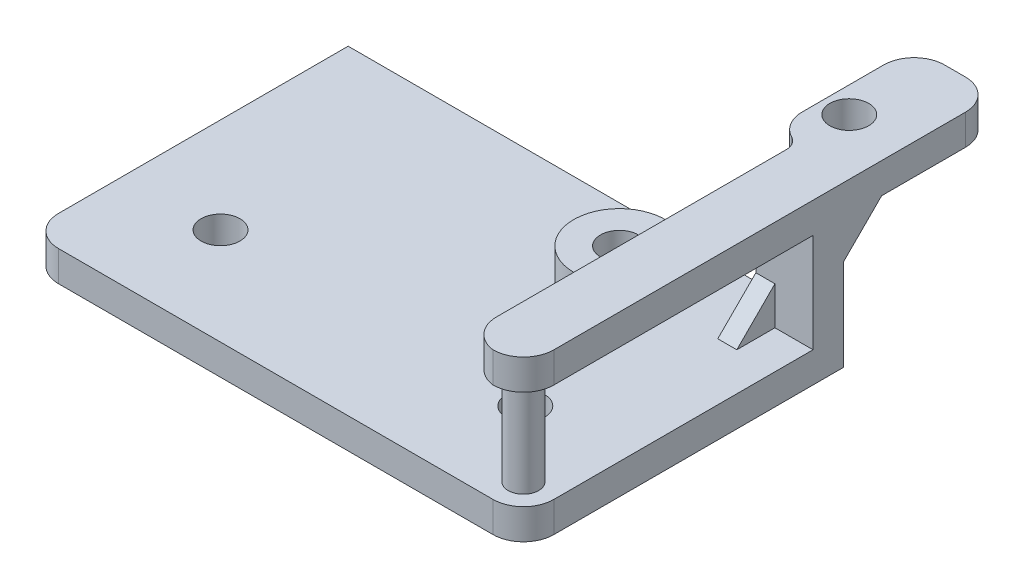
ISO-10303-21;
HEADER;
FILE_DESCRIPTION(('STEP AP214'),'2;1');
FILE_NAME('part.step','',(''),(''),'','','');
FILE_SCHEMA(('AUTOMOTIVE_DESIGN { 1 0 10303 214 1 1 1 1 }'));
ENDSEC;
DATA;
#1=APPLICATION_CONTEXT('core data for automotive mechanical design processes');
#2=APPLICATION_PROTOCOL_DEFINITION('international standard','automotive_design',2000,#1);
#3=PRODUCT_CONTEXT('',#1,'mechanical');
#4=PRODUCT('Part','Part','',(#3));
#5=PRODUCT_RELATED_PRODUCT_CATEGORY('part','',(#4));
#6=PRODUCT_DEFINITION_FORMATION('','',#4);
#7=PRODUCT_DEFINITION_CONTEXT('part definition',#1,'design');
#8=PRODUCT_DEFINITION('design','',#6,#7);
#9=PRODUCT_DEFINITION_SHAPE('','',#8);
#10=(LENGTH_UNIT() NAMED_UNIT(*) SI_UNIT(.MILLI.,.METRE.));
#11=(NAMED_UNIT(*) PLANE_ANGLE_UNIT() SI_UNIT($,.RADIAN.));
#12=(NAMED_UNIT(*) SI_UNIT($,.STERADIAN.) SOLID_ANGLE_UNIT());
#13=UNCERTAINTY_MEASURE_WITH_UNIT(LENGTH_MEASURE(1.E-05),#10,'distance_accuracy_value','');
#14=(GEOMETRIC_REPRESENTATION_CONTEXT(3) GLOBAL_UNCERTAINTY_ASSIGNED_CONTEXT((#13)) GLOBAL_UNIT_ASSIGNED_CONTEXT((#10,
#11,#12)) REPRESENTATION_CONTEXT('',''));
#15=CARTESIAN_POINT('',(0.,0.,0.));
#16=DIRECTION('',(0.,0.,1.));
#17=DIRECTION('',(1.,0.,0.));
#18=AXIS2_PLACEMENT_3D('',#15,#16,#17);
#19=CARTESIAN_POINT('',(45.4999999999992,9.,-32.1043329903239));
#20=DIRECTION('',(0.,-1.,0.));
#21=DIRECTION('',(0.,0.,-1.));
#22=AXIS2_PLACEMENT_3D('',#19,#20,#21);
#23=CYLINDRICAL_SURFACE('',#22,2.50000000000001);
#24=CARTESIAN_POINT('',(45.4999999999992,9.,-32.1043329903239));
#25=DIRECTION('',(0.,1.,0.));
#26=DIRECTION('',(0.,0.,1.));
#27=AXIS2_PLACEMENT_3D('',#24,#25,#26);
#28=CIRCLE('',#27,2.50000000000001);
#29=CARTESIAN_POINT('',(45.4999999999992,9.,-29.6043329903239));
#30=VERTEX_POINT('',#29);
#31=EDGE_CURVE('E232',#30,#30,#28,.T.);
#32=ORIENTED_EDGE('',*,*,#31,.T.);
#33=EDGE_LOOP('',(#32));
#34=FACE_BOUND('',#33,.T.);
#35=CARTESIAN_POINT('',(45.4999999999992,6.,-32.1043329903239));
#36=DIRECTION('',(0.,-1.,0.));
#37=DIRECTION('',(0.,0.,-1.));
#38=AXIS2_PLACEMENT_3D('',#35,#36,#37);
#39=CIRCLE('',#38,2.50000000000001);
#40=CARTESIAN_POINT('',(45.4999999999992,6.,-34.6043329903239));
#41=VERTEX_POINT('',#40);
#42=EDGE_CURVE('E243',#41,#41,#39,.T.);
#43=ORIENTED_EDGE('',*,*,#42,.T.);
#44=EDGE_LOOP('',(#43));
#45=FACE_BOUND('',#44,.T.);
#46=ADVANCED_FACE('F50',(#34,#45),#23,.F.);
#47=CARTESIAN_POINT('',(65.,17.,-38.));
#48=DIRECTION('',(0.,0.,-1.));
#49=DIRECTION('',(-1.,0.,0.));
#50=AXIS2_PLACEMENT_3D('',#47,#48,#49);
#51=PLANE('',#50);
#52=DIRECTION('',(1.,0.,0.));
#53=VECTOR('',#52,1.);
#54=CARTESIAN_POINT('',(65.,17.,-38.));
#55=LINE('',#54,#53);
#56=CARTESIAN_POINT('',(57.5,17.,-38.));
#57=VERTEX_POINT('',#56);
#58=CARTESIAN_POINT('',(65.,17.,-38.));
#59=VERTEX_POINT('',#58);
#60=EDGE_CURVE('E320',#57,#59,#55,.T.);
#61=ORIENTED_EDGE('',*,*,#60,.F.);
#62=DIRECTION('',(0.,-1.,0.));
#63=VECTOR('',#62,1.);
#64=CARTESIAN_POINT('',(57.5,17.,-38.));
#65=LINE('',#64,#63);
#66=CARTESIAN_POINT('',(57.5,9.,-38.));
#67=VERTEX_POINT('',#66);
#68=EDGE_CURVE('E256',#57,#67,#65,.T.);
#69=ORIENTED_EDGE('',*,*,#68,.T.);
#70=DIRECTION('',(1.,0.,0.));
#71=VECTOR('',#70,1.);
#72=CARTESIAN_POINT('',(55.,9.,-38.));
#73=LINE('',#72,#71);
#74=CARTESIAN_POINT('',(60.,9.,-38.));
#75=VERTEX_POINT('',#74);
#76=EDGE_CURVE('E278',#67,#75,#73,.T.);
#77=ORIENTED_EDGE('',*,*,#76,.T.);
#78=DIRECTION('',(0.,1.,0.));
#79=VECTOR('',#78,1.);
#80=CARTESIAN_POINT('',(60.,9.,-38.));
#81=LINE('',#80,#79);
#82=CARTESIAN_POINT('',(60.,4.,-38.));
#83=VERTEX_POINT('',#82);
#84=EDGE_CURVE('E272',#83,#75,#81,.T.);
#85=ORIENTED_EDGE('',*,*,#84,.F.);
#86=DIRECTION('',(1.,0.,0.));
#87=VECTOR('',#86,1.);
#88=CARTESIAN_POINT('',(65.,4.,-38.));
#89=LINE('',#88,#87);
#90=CARTESIAN_POINT('',(65.,4.,-38.));
#91=VERTEX_POINT('',#90);
#92=EDGE_CURVE('E317',#83,#91,#89,.T.);
#93=ORIENTED_EDGE('',*,*,#92,.T.);
#94=DIRECTION('',(0.,-1.,0.));
#95=VECTOR('',#94,1.);
#96=CARTESIAN_POINT('',(65.,17.,-38.));
#97=LINE('',#96,#95);
#98=EDGE_CURVE('E322',#59,#91,#97,.T.);
#99=ORIENTED_EDGE('',*,*,#98,.F.);
#100=EDGE_LOOP('',(#61,#69,#77,#85,#93,#99));
#101=FACE_BOUND('',#100,.T.);
#102=ADVANCED_FACE('F465',(#101),#51,.F.);
#103=CARTESIAN_POINT('',(4.,4.,-4.));
#104=DIRECTION('',(0.,1.,0.));
#105=DIRECTION('',(0.,0.,1.));
#106=AXIS2_PLACEMENT_3D('',#103,#104,#105);
#107=PLANE('',#106);
#108=CARTESIAN_POINT('',(45.4999999999992,4.,-32.1043329903239));
#109=DIRECTION('',(0.,1.,0.));
#110=DIRECTION('',(0.,0.,1.));
#111=AXIS2_PLACEMENT_3D('',#108,#109,#110);
#112=CIRCLE('',#111,5.99999999999999);
#113=CARTESIAN_POINT('',(45.4999999999992,4.,-26.1043329903239));
#114=VERTEX_POINT('',#113);
#115=EDGE_CURVE('E235',#114,#114,#112,.T.);
#116=ORIENTED_EDGE('',*,*,#115,.F.);
#117=EDGE_LOOP('',(#116));
#118=FACE_BOUND('',#117,.T.);
#119=CARTESIAN_POINT('',(52.5,4.,-12.75));
#120=DIRECTION('',(0.,1.,0.));
#121=DIRECTION('',(0.,0.,1.));
#122=AXIS2_PLACEMENT_3D('',#119,#120,#121);
#123=CIRCLE('',#122,2.55);
#124=CARTESIAN_POINT('',(52.5,4.,-10.2));
#125=VERTEX_POINT('',#124);
#126=EDGE_CURVE('E327',#125,#125,#123,.T.);
#127=ORIENTED_EDGE('',*,*,#126,.F.);
#128=EDGE_LOOP('',(#127));
#129=FACE_BOUND('',#128,.T.);
#130=DIRECTION('',(1.,0.,0.));
#131=VECTOR('',#130,1.);
#132=CARTESIAN_POINT('',(4.00000000000003,4.,0.));
#133=LINE('',#132,#131);
#134=CARTESIAN_POINT('',(4.,4.,0.));
#135=VERTEX_POINT('',#134);
#136=CARTESIAN_POINT('',(61.,4.,0.));
#137=VERTEX_POINT('',#136);
#138=EDGE_CURVE('E346',#135,#137,#133,.T.);
#139=ORIENTED_EDGE('',*,*,#138,.T.);
#140=CARTESIAN_POINT('',(61.,4.,-4.));
#141=DIRECTION('',(0.,1.,0.));
#142=DIRECTION('',(0.,0.,-1.));
#143=AXIS2_PLACEMENT_3D('',#140,#141,#142);
#144=CIRCLE('',#143,4.);
#145=CARTESIAN_POINT('',(65.,4.,-4.00000000000003));
#146=VERTEX_POINT('',#145);
#147=EDGE_CURVE('E348',#137,#146,#144,.T.);
#148=ORIENTED_EDGE('',*,*,#147,.T.);
#149=DIRECTION('',(0.,0.,-1.));
#150=VECTOR('',#149,1.);
#151=CARTESIAN_POINT('',(65.,4.,-4.00000000000003));
#152=LINE('',#151,#150);
#153=EDGE_CURVE('E338',#146,#91,#152,.T.);
#154=ORIENTED_EDGE('',*,*,#153,.T.);
#155=ORIENTED_EDGE('',*,*,#92,.F.);
#156=DIRECTION('',(0.,0.,-1.));
#157=VECTOR('',#156,1.);
#158=CARTESIAN_POINT('',(60.,4.,-38.));
#159=LINE('',#158,#157);
#160=CARTESIAN_POINT('',(60.,4.,-33.));
#161=VERTEX_POINT('',#160);
#162=EDGE_CURVE('E269',#161,#83,#159,.T.);
#163=ORIENTED_EDGE('',*,*,#162,.F.);
#164=DIRECTION('',(1.,0.,0.));
#165=VECTOR('',#164,1.);
#166=CARTESIAN_POINT('',(55.,4.,-33.));
#167=LINE('',#166,#165);
#168=CARTESIAN_POINT('',(57.5,4.,-33.));
#169=VERTEX_POINT('',#168);
#170=EDGE_CURVE('E279',#169,#161,#167,.T.);
#171=ORIENTED_EDGE('',*,*,#170,.F.);
#172=DIRECTION('',(0.,0.,1.));
#173=VECTOR('',#172,1.);
#174=CARTESIAN_POINT('',(57.5,4.,0.));
#175=LINE('',#174,#173);
#176=CARTESIAN_POINT('',(57.5,4.,-42.));
#177=VERTEX_POINT('',#176);
#178=EDGE_CURVE('E254',#177,#169,#175,.T.);
#179=ORIENTED_EDGE('',*,*,#178,.F.);
#180=DIRECTION('',(-1.,0.,0.));
#181=VECTOR('',#180,1.);
#182=CARTESIAN_POINT('',(0.,4.,-42.));
#183=LINE('',#182,#181);
#184=CARTESIAN_POINT('',(0.,4.,-42.));
#185=VERTEX_POINT('',#184);
#186=EDGE_CURVE('E281',#177,#185,#183,.T.);
#187=ORIENTED_EDGE('',*,*,#186,.T.);
#188=DIRECTION('',(0.,0.,1.));
#189=VECTOR('',#188,1.);
#190=CARTESIAN_POINT('',(0.,4.,-4.00000000000003));
#191=LINE('',#190,#189);
#192=CARTESIAN_POINT('',(0.,4.,-4.00000000000003));
#193=VERTEX_POINT('',#192);
#194=EDGE_CURVE('E341',#185,#193,#191,.T.);
#195=ORIENTED_EDGE('',*,*,#194,.T.);
#196=CARTESIAN_POINT('',(4.,4.,-4.));
#197=DIRECTION('',(0.,1.,0.));
#198=DIRECTION('',(0.,0.,1.));
#199=AXIS2_PLACEMENT_3D('',#196,#197,#198);
#200=CIRCLE('',#199,4.);
#201=EDGE_CURVE('E344',#193,#135,#200,.T.);
#202=ORIENTED_EDGE('',*,*,#201,.T.);
#203=EDGE_LOOP('',(#139,#148,#154,#155,#163,#171,#179,#187,#195,#202));
#204=FACE_BOUND('',#203,.T.);
#205=CARTESIAN_POINT('',(12.5,4.,-12.75));
#206=DIRECTION('',(0.,1.,0.));
#207=DIRECTION('',(0.,0.,1.));
#208=AXIS2_PLACEMENT_3D('',#205,#206,#207);
#209=CIRCLE('',#208,2.55);
#210=CARTESIAN_POINT('',(12.5,4.,-10.2));
#211=VERTEX_POINT('',#210);
#212=EDGE_CURVE('E333',#211,#211,#209,.T.);
#213=ORIENTED_EDGE('',*,*,#212,.F.);
#214=EDGE_LOOP('',(#213));
#215=FACE_BOUND('',#214,.T.);
#216=CARTESIAN_POINT('',(61.,4.,-4.));
#217=DIRECTION('',(0.,1.,0.));
#218=DIRECTION('',(0.,0.,1.));
#219=AXIS2_PLACEMENT_3D('',#216,#217,#218);
#220=CIRCLE('',#219,2.);
#221=CARTESIAN_POINT('',(61.,4.,-5.99999999999999));
#222=VERTEX_POINT('',#221);
#223=EDGE_CURVE('E314',#222,#222,#220,.T.);
#224=ORIENTED_EDGE('',*,*,#223,.F.);
#225=EDGE_LOOP('',(#224));
#226=FACE_BOUND('',#225,.T.);
#227=ADVANCED_FACE('F471',(#118,#129,#204,#215,#226),#107,.T.);
#228=CARTESIAN_POINT('',(0.,4.,-42.));
#229=DIRECTION('',(0.,0.,1.));
#230=DIRECTION('',(1.,0.,0.));
#231=AXIS2_PLACEMENT_3D('',#228,#229,#230);
#232=PLANE('',#231);
#233=DIRECTION('',(-1.,0.,0.));
#234=VECTOR('',#233,1.);
#235=CARTESIAN_POINT('',(65.,17.,-42.));
#236=LINE('',#235,#234);
#237=CARTESIAN_POINT('',(61.5,17.,-42.));
#238=VERTEX_POINT('',#237);
#239=CARTESIAN_POINT('',(57.5,17.,-42.));
#240=VERTEX_POINT('',#239);
#241=EDGE_CURVE('E293',#238,#240,#236,.T.);
#242=ORIENTED_EDGE('',*,*,#241,.F.);
#243=DIRECTION('',(0.,-1.,0.));
#244=VECTOR('',#243,1.);
#245=CARTESIAN_POINT('',(61.5,17.,-42.));
#246=LINE('',#245,#244);
#247=CARTESIAN_POINT('',(61.5,12.,-42.));
#248=VERTEX_POINT('',#247);
#249=EDGE_CURVE('E225',#238,#248,#246,.T.);
#250=ORIENTED_EDGE('',*,*,#249,.T.);
#251=DIRECTION('',(-1.,0.,0.));
#252=VECTOR('',#251,1.);
#253=CARTESIAN_POINT('',(72.0710678118655,12.,-42.));
#254=LINE('',#253,#252);
#255=CARTESIAN_POINT('',(65.,12.,-42.));
#256=VERTEX_POINT('',#255);
#257=EDGE_CURVE('E221',#256,#248,#254,.T.);
#258=ORIENTED_EDGE('',*,*,#257,.F.);
#259=DIRECTION('',(0.,-1.,0.));
#260=VECTOR('',#259,1.);
#261=CARTESIAN_POINT('',(65.,4.,-42.));
#262=LINE('',#261,#260);
#263=CARTESIAN_POINT('',(65.,0.,-42.));
#264=VERTEX_POINT('',#263);
#265=EDGE_CURVE('E204',#256,#264,#262,.T.);
#266=ORIENTED_EDGE('',*,*,#265,.T.);
#267=DIRECTION('',(-1.,0.,0.));
#268=VECTOR('',#267,1.);
#269=CARTESIAN_POINT('',(0.,0.,-42.));
#270=LINE('',#269,#268);
#271=CARTESIAN_POINT('',(0.,0.,-42.));
#272=VERTEX_POINT('',#271);
#273=EDGE_CURVE('E352',#264,#272,#270,.T.);
#274=ORIENTED_EDGE('',*,*,#273,.T.);
#275=DIRECTION('',(0.,-1.,0.));
#276=VECTOR('',#275,1.);
#277=CARTESIAN_POINT('',(0.,4.,-42.));
#278=LINE('',#277,#276);
#279=EDGE_CURVE('E218',#185,#272,#278,.T.);
#280=ORIENTED_EDGE('',*,*,#279,.F.);
#281=ORIENTED_EDGE('',*,*,#186,.F.);
#282=DIRECTION('',(0.,1.,0.));
#283=VECTOR('',#282,1.);
#284=CARTESIAN_POINT('',(57.5,-40.6346278129436,-42.));
#285=LINE('',#284,#283);
#286=EDGE_CURVE('E257',#177,#240,#285,.T.);
#287=ORIENTED_EDGE('',*,*,#286,.T.);
#288=EDGE_LOOP('',(#242,#250,#258,#266,#274,#280,#281,#287));
#289=FACE_BOUND('',#288,.T.);
#290=ADVANCED_FACE('F223',(#289),#232,.F.);
#291=CARTESIAN_POINT('',(0.,4.,-4.00000000000003));
#292=DIRECTION('',(1.,0.,0.));
#293=DIRECTION('',(0.,0.,-1.));
#294=AXIS2_PLACEMENT_3D('',#291,#292,#293);
#295=PLANE('',#294);
#296=ORIENTED_EDGE('',*,*,#194,.F.);
#297=ORIENTED_EDGE('',*,*,#279,.T.);
#298=DIRECTION('',(0.,0.,1.));
#299=VECTOR('',#298,1.);
#300=CARTESIAN_POINT('',(0.,0.,-4.00000000000003));
#301=LINE('',#300,#299);
#302=CARTESIAN_POINT('',(0.,0.,-4.00000000000003));
#303=VERTEX_POINT('',#302);
#304=EDGE_CURVE('E354',#272,#303,#301,.T.);
#305=ORIENTED_EDGE('',*,*,#304,.T.);
#306=DIRECTION('',(0.,-1.,0.));
#307=VECTOR('',#306,1.);
#308=CARTESIAN_POINT('',(0.,4.,-4.00000000000003));
#309=LINE('',#308,#307);
#310=EDGE_CURVE('E368',#193,#303,#309,.T.);
#311=ORIENTED_EDGE('',*,*,#310,.F.);
#312=EDGE_LOOP('',(#296,#297,#305,#311));
#313=FACE_BOUND('',#312,.T.);
#314=ADVANCED_FACE('F516',(#313),#295,.F.);
#315=CARTESIAN_POINT('',(4.,21.,-4.));
#316=DIRECTION('',(0.,1.,0.));
#317=DIRECTION('',(0.,0.,1.));
#318=AXIS2_PLACEMENT_3D('',#315,#316,#317);
#319=PLANE('',#318);
#320=DIRECTION('',(1.,0.,0.));
#321=VECTOR('',#320,1.);
#322=CARTESIAN_POINT('',(65.,21.,-62.));
#323=LINE('',#322,#321);
#324=CARTESIAN_POINT('',(58.2644445885543,21.,-62.));
#325=VERTEX_POINT('',#324);
#326=CARTESIAN_POINT('',(61.,21.,-62.));
#327=VERTEX_POINT('',#326);
#328=EDGE_CURVE('E292',#325,#327,#323,.T.);
#329=ORIENTED_EDGE('',*,*,#328,.F.);
#330=CARTESIAN_POINT('',(58.2644445885543,21.,-58.));
#331=DIRECTION('',(0.,1.,0.));
#332=DIRECTION('',(0.,0.,1.));
#333=AXIS2_PLACEMENT_3D('',#330,#331,#332);
#334=CIRCLE('',#333,4.);
#335=CARTESIAN_POINT('',(54.2644445885543,21.,-58.));
#336=VERTEX_POINT('',#335);
#337=EDGE_CURVE('E403',#325,#336,#334,.T.);
#338=ORIENTED_EDGE('',*,*,#337,.T.);
#339=DIRECTION('',(0.,0.,-1.));
#340=VECTOR('',#339,1.);
#341=CARTESIAN_POINT('',(54.2644445885543,21.,-44.));
#342=LINE('',#341,#340);
#343=CARTESIAN_POINT('',(54.2644445885543,21.,-47.3252085514854));
#344=VERTEX_POINT('',#343);
#345=EDGE_CURVE('E424',#344,#336,#342,.T.);
#346=ORIENTED_EDGE('',*,*,#345,.F.);
#347=CARTESIAN_POINT('',(58.2644445885543,21.,-47.3252085514854));
#348=DIRECTION('',(0.,1.,0.));
#349=DIRECTION('',(0.,0.,1.));
#350=AXIS2_PLACEMENT_3D('',#347,#348,#349);
#351=CIRCLE('',#350,4.);
#352=CARTESIAN_POINT('',(56.4214815295181,21.,-43.7750695171618));
#353=VERTEX_POINT('',#352);
#354=EDGE_CURVE('E401',#344,#353,#351,.T.);
#355=ORIENTED_EDGE('',*,*,#354,.T.);
#356=CARTESIAN_POINT('',(55.5,21.,-42.));
#357=DIRECTION('',(0.,1.,0.));
#358=DIRECTION('',(0.,0.,1.));
#359=AXIS2_PLACEMENT_3D('',#356,#357,#358);
#360=CIRCLE('',#359,2.);
#361=CARTESIAN_POINT('',(57.5,21.,-42.));
#362=VERTEX_POINT('',#361);
#363=EDGE_CURVE('E259',#362,#353,#360,.T.);
#364=ORIENTED_EDGE('',*,*,#363,.F.);
#365=DIRECTION('',(0.,0.,-1.));
#366=VECTOR('',#365,1.);
#367=CARTESIAN_POINT('',(57.5,21.,0.));
#368=LINE('',#367,#366);
#369=CARTESIAN_POINT('',(57.5,21.,-3.96862696659688));
#370=VERTEX_POINT('',#369);
#371=EDGE_CURVE('E251',#370,#362,#368,.T.);
#372=ORIENTED_EDGE('',*,*,#371,.F.);
#373=CARTESIAN_POINT('',(61.5,21.,-3.96862696659689));
#374=DIRECTION('',(0.,1.,0.));
#375=DIRECTION('',(0.,0.,1.));
#376=AXIS2_PLACEMENT_3D('',#373,#374,#375);
#377=CIRCLE('',#376,4.);
#378=CARTESIAN_POINT('',(61.,21.,0.));
#379=VERTEX_POINT('',#378);
#380=EDGE_CURVE('E391',#370,#379,#377,.T.);
#381=ORIENTED_EDGE('',*,*,#380,.T.);
#382=CARTESIAN_POINT('',(61.,21.,-4.));
#383=DIRECTION('',(0.,1.,0.));
#384=DIRECTION('',(0.,0.,1.));
#385=AXIS2_PLACEMENT_3D('',#382,#383,#384);
#386=CIRCLE('',#385,4.);
#387=CARTESIAN_POINT('',(65.,21.,-4.));
#388=VERTEX_POINT('',#387);
#389=EDGE_CURVE('E299',#379,#388,#386,.T.);
#390=ORIENTED_EDGE('',*,*,#389,.T.);
#391=DIRECTION('',(0.,0.,-1.));
#392=VECTOR('',#391,1.);
#393=CARTESIAN_POINT('',(65.,21.,-42.));
#394=LINE('',#393,#392);
#395=CARTESIAN_POINT('',(65.,21.,-58.));
#396=VERTEX_POINT('',#395);
#397=EDGE_CURVE('E301',#388,#396,#394,.T.);
#398=ORIENTED_EDGE('',*,*,#397,.T.);
#399=CARTESIAN_POINT('',(61.,21.,-58.));
#400=DIRECTION('',(0.,1.,0.));
#401=DIRECTION('',(0.,0.,1.));
#402=AXIS2_PLACEMENT_3D('',#399,#400,#401);
#403=CIRCLE('',#402,4.);
#404=EDGE_CURVE('E378',#396,#327,#403,.T.);
#405=ORIENTED_EDGE('',*,*,#404,.T.);
#406=EDGE_LOOP('',(#329,#338,#346,#355,#364,#372,#381,#390,#398,#405));
#407=FACE_BOUND('',#406,.T.);
#408=CARTESIAN_POINT('',(57.6499999999992,21.,-50.1043329903239));
#409=DIRECTION('',(0.,1.,0.));
#410=DIRECTION('',(0.,0.,1.));
#411=AXIS2_PLACEMENT_3D('',#408,#409,#410);
#412=CIRCLE('',#411,2.55);
#413=CARTESIAN_POINT('',(57.6499999999992,21.,-47.5543329903239));
#414=VERTEX_POINT('',#413);
#415=EDGE_CURVE('E285',#414,#414,#412,.T.);
#416=ORIENTED_EDGE('',*,*,#415,.F.);
#417=EDGE_LOOP('',(#416));
#418=FACE_BOUND('',#417,.T.);
#419=ADVANCED_FACE('F422',(#407,#418),#319,.T.);
#420=CARTESIAN_POINT('',(4.,17.,-4.));
#421=DIRECTION('',(0.,1.,0.));
#422=DIRECTION('',(0.,0.,1.));
#423=AXIS2_PLACEMENT_3D('',#420,#421,#422);
#424=PLANE('',#423);
#425=CARTESIAN_POINT('',(61.,17.,-4.));
#426=DIRECTION('',(0.,1.,0.));
#427=DIRECTION('',(0.,0.,1.));
#428=AXIS2_PLACEMENT_3D('',#425,#426,#427);
#429=CIRCLE('',#428,2.);
#430=CARTESIAN_POINT('',(61.,17.,-5.99999999999999));
#431=VERTEX_POINT('',#430);
#432=EDGE_CURVE('E313',#431,#431,#429,.T.);
#433=ORIENTED_EDGE('',*,*,#432,.T.);
#434=EDGE_LOOP('',(#433));
#435=FACE_BOUND('',#434,.T.);
#436=CARTESIAN_POINT('',(61.,17.,-4.));
#437=DIRECTION('',(0.,1.,0.));
#438=DIRECTION('',(0.,0.,1.));
#439=AXIS2_PLACEMENT_3D('',#436,#437,#438);
#440=CIRCLE('',#439,4.);
#441=CARTESIAN_POINT('',(61.,17.,0.));
#442=VERTEX_POINT('',#441);
#443=CARTESIAN_POINT('',(65.,17.,-4.));
#444=VERTEX_POINT('',#443);
#445=EDGE_CURVE('E298',#442,#444,#440,.T.);
#446=ORIENTED_EDGE('',*,*,#445,.F.);
#447=CARTESIAN_POINT('',(61.5,17.,-3.96862696659689));
#448=DIRECTION('',(0.,1.,0.));
#449=DIRECTION('',(0.,0.,1.));
#450=AXIS2_PLACEMENT_3D('',#447,#448,#449);
#451=CIRCLE('',#450,4.);
#452=CARTESIAN_POINT('',(57.5,17.,-3.96862696659688));
#453=VERTEX_POINT('',#452);
#454=EDGE_CURVE('E393',#442,#453,#451,.F.);
#455=ORIENTED_EDGE('',*,*,#454,.T.);
#456=DIRECTION('',(0.,0.,-1.));
#457=VECTOR('',#456,1.);
#458=CARTESIAN_POINT('',(57.5,17.,-4.00000000000001));
#459=LINE('',#458,#457);
#460=EDGE_CURVE('E267',#453,#57,#459,.T.);
#461=ORIENTED_EDGE('',*,*,#460,.T.);
#462=ORIENTED_EDGE('',*,*,#60,.T.);
#463=DIRECTION('',(0.,0.,-1.));
#464=VECTOR('',#463,1.);
#465=CARTESIAN_POINT('',(65.,17.,-42.));
#466=LINE('',#465,#464);
#467=EDGE_CURVE('E302',#444,#59,#466,.T.);
#468=ORIENTED_EDGE('',*,*,#467,.F.);
#469=EDGE_LOOP('',(#446,#455,#461,#462,#468));
#470=FACE_BOUND('',#469,.T.);
#471=ADVANCED_FACE('F512',(#435,#470),#424,.F.);
#472=CARTESIAN_POINT('',(65.,17.,-62.));
#473=DIRECTION('',(0.,1.,0.));
#474=DIRECTION('',(0.,0.,1.));
#475=AXIS2_PLACEMENT_3D('',#472,#473,#474);
#476=PLANE('',#475);
#477=CARTESIAN_POINT('',(57.6499999999992,17.,-50.1043329903239));
#478=DIRECTION('',(0.,1.,0.));
#479=DIRECTION('',(0.,0.,1.));
#480=AXIS2_PLACEMENT_3D('',#477,#478,#479);
#481=CIRCLE('',#480,2.55);
#482=CARTESIAN_POINT('',(57.6499999999992,17.,-47.5543329903239));
#483=VERTEX_POINT('',#482);
#484=EDGE_CURVE('E288',#483,#483,#481,.T.);
#485=ORIENTED_EDGE('',*,*,#484,.T.);
#486=EDGE_LOOP('',(#485));
#487=FACE_BOUND('',#486,.T.);
#488=DIRECTION('',(0.,0.,-1.));
#489=VECTOR('',#488,1.);
#490=CARTESIAN_POINT('',(54.2644445885543,17.,-62.));
#491=LINE('',#490,#489);
#492=CARTESIAN_POINT('',(54.2644445885543,17.,-47.3252085514854));
#493=VERTEX_POINT('',#492);
#494=CARTESIAN_POINT('',(54.2644445885543,17.,-58.));
#495=VERTEX_POINT('',#494);
#496=EDGE_CURVE('E412',#493,#495,#491,.T.);
#497=ORIENTED_EDGE('',*,*,#496,.T.);
#498=CARTESIAN_POINT('',(58.2644445885543,17.,-58.));
#499=DIRECTION('',(0.,1.,0.));
#500=DIRECTION('',(0.,0.,1.));
#501=AXIS2_PLACEMENT_3D('',#498,#499,#500);
#502=CIRCLE('',#501,4.);
#503=CARTESIAN_POINT('',(58.2644445885543,17.,-62.));
#504=VERTEX_POINT('',#503);
#505=EDGE_CURVE('E58',#495,#504,#502,.F.);
#506=ORIENTED_EDGE('',*,*,#505,.T.);
#507=DIRECTION('',(-1.,0.,0.));
#508=VECTOR('',#507,1.);
#509=CARTESIAN_POINT('',(65.,17.,-62.));
#510=LINE('',#509,#508);
#511=CARTESIAN_POINT('',(61.,17.,-62.));
#512=VERTEX_POINT('',#511);
#513=EDGE_CURVE('E289',#512,#504,#510,.T.);
#514=ORIENTED_EDGE('',*,*,#513,.F.);
#515=CARTESIAN_POINT('',(61.,17.,-58.));
#516=DIRECTION('',(0.,1.,0.));
#517=DIRECTION('',(0.,0.,1.));
#518=AXIS2_PLACEMENT_3D('',#515,#516,#517);
#519=CIRCLE('',#518,4.);
#520=CARTESIAN_POINT('',(65.,17.,-58.));
#521=VERTEX_POINT('',#520);
#522=EDGE_CURVE('E374',#512,#521,#519,.F.);
#523=ORIENTED_EDGE('',*,*,#522,.T.);
#524=DIRECTION('',(0.,0.,1.));
#525=VECTOR('',#524,1.);
#526=CARTESIAN_POINT('',(65.,17.,-62.));
#527=LINE('',#526,#525);
#528=CARTESIAN_POINT('',(65.,17.,-47.));
#529=VERTEX_POINT('',#528);
#530=EDGE_CURVE('E295',#521,#529,#527,.T.);
#531=ORIENTED_EDGE('',*,*,#530,.T.);
#532=DIRECTION('',(-1.,0.,0.));
#533=VECTOR('',#532,1.);
#534=CARTESIAN_POINT('',(72.0710678118655,17.,-47.));
#535=LINE('',#534,#533);
#536=CARTESIAN_POINT('',(61.5,17.,-47.));
#537=VERTEX_POINT('',#536);
#538=EDGE_CURVE('E229',#529,#537,#535,.T.);
#539=ORIENTED_EDGE('',*,*,#538,.T.);
#540=DIRECTION('',(0.,0.,1.));
#541=VECTOR('',#540,1.);
#542=CARTESIAN_POINT('',(61.5,17.,-47.));
#543=LINE('',#542,#541);
#544=EDGE_CURVE('E245',#537,#238,#543,.T.);
#545=ORIENTED_EDGE('',*,*,#544,.T.);
#546=ORIENTED_EDGE('',*,*,#241,.T.);
#547=CARTESIAN_POINT('',(55.5,17.,-42.));
#548=DIRECTION('',(0.,1.,0.));
#549=DIRECTION('',(0.,0.,1.));
#550=AXIS2_PLACEMENT_3D('',#547,#548,#549);
#551=CIRCLE('',#550,2.);
#552=CARTESIAN_POINT('',(56.4214815295181,17.,-43.7750695171618));
#553=VERTEX_POINT('',#552);
#554=EDGE_CURVE('E385',#240,#553,#551,.T.);
#555=ORIENTED_EDGE('',*,*,#554,.T.);
#556=CARTESIAN_POINT('',(58.2644445885543,17.,-47.3252085514854));
#557=DIRECTION('',(0.,1.,0.));
#558=DIRECTION('',(0.,0.,1.));
#559=AXIS2_PLACEMENT_3D('',#556,#557,#558);
#560=CIRCLE('',#559,4.);
#561=EDGE_CURVE('E65',#553,#493,#560,.F.);
#562=ORIENTED_EDGE('',*,*,#561,.T.);
#563=EDGE_LOOP('',(#497,#506,#514,#523,#531,#539,#545,#546,#555,#562));
#564=FACE_BOUND('',#563,.T.);
#565=ADVANCED_FACE('F411',(#487,#564),#476,.F.);
#566=CARTESIAN_POINT('',(0.,0.,-62.));
#567=DIRECTION('',(0.,0.,1.));
#568=DIRECTION('',(1.,0.,0.));
#569=AXIS2_PLACEMENT_3D('',#566,#567,#568);
#570=PLANE('',#569);
#571=ORIENTED_EDGE('',*,*,#513,.T.);
#572=DIRECTION('',(0.,1.,0.));
#573=VECTOR('',#572,1.);
#574=CARTESIAN_POINT('',(58.2644445885543,0.,-62.));
#575=LINE('',#574,#573);
#576=EDGE_CURVE('E395',#504,#325,#575,.T.);
#577=ORIENTED_EDGE('',*,*,#576,.T.);
#578=ORIENTED_EDGE('',*,*,#328,.T.);
#579=DIRECTION('',(0.,-1.,0.));
#580=VECTOR('',#579,1.);
#581=CARTESIAN_POINT('',(61.,0.,-62.));
#582=LINE('',#581,#580);
#583=EDGE_CURVE('E217',#327,#512,#582,.T.);
#584=ORIENTED_EDGE('',*,*,#583,.T.);
#585=EDGE_LOOP('',(#571,#577,#578,#584));
#586=FACE_BOUND('',#585,.T.);
#587=ADVANCED_FACE('F416',(#586),#570,.F.);
#588=CARTESIAN_POINT('',(4.,0.,-4.));
#589=DIRECTION('',(0.,1.,0.));
#590=DIRECTION('',(0.,0.,1.));
#591=AXIS2_PLACEMENT_3D('',#588,#589,#590);
#592=PLANE('',#591);
#593=CARTESIAN_POINT('',(45.4999999999992,0.,-32.1043329903239));
#594=DIRECTION('',(0.,-1.,0.));
#595=DIRECTION('',(0.,0.,-1.));
#596=AXIS2_PLACEMENT_3D('',#593,#594,#595);
#597=CIRCLE('',#596,4.5);
#598=CARTESIAN_POINT('',(45.4999999999992,0.,-36.6043329903239));
#599=VERTEX_POINT('',#598);
#600=EDGE_CURVE('E239',#599,#599,#597,.T.);
#601=ORIENTED_EDGE('',*,*,#600,.F.);
#602=EDGE_LOOP('',(#601));
#603=FACE_BOUND('',#602,.T.);
#604=DIRECTION('',(0.,0.,-1.));
#605=VECTOR('',#604,1.);
#606=CARTESIAN_POINT('',(65.,0.,-4.00000000000003));
#607=LINE('',#606,#605);
#608=CARTESIAN_POINT('',(65.,0.,-4.00000000000003));
#609=VERTEX_POINT('',#608);
#610=EDGE_CURVE('E213',#609,#264,#607,.T.);
#611=ORIENTED_EDGE('',*,*,#610,.F.);
#612=CARTESIAN_POINT('',(61.,0.,-4.));
#613=DIRECTION('',(0.,1.,0.));
#614=DIRECTION('',(0.,0.,-1.));
#615=AXIS2_PLACEMENT_3D('',#612,#613,#614);
#616=CIRCLE('',#615,4.);
#617=CARTESIAN_POINT('',(61.,0.,0.));
#618=VERTEX_POINT('',#617);
#619=EDGE_CURVE('E342',#618,#609,#616,.T.);
#620=ORIENTED_EDGE('',*,*,#619,.F.);
#621=DIRECTION('',(1.,0.,0.));
#622=VECTOR('',#621,1.);
#623=CARTESIAN_POINT('',(4.00000000000003,0.,0.));
#624=LINE('',#623,#622);
#625=CARTESIAN_POINT('',(4.,0.,0.));
#626=VERTEX_POINT('',#625);
#627=EDGE_CURVE('E358',#626,#618,#624,.T.);
#628=ORIENTED_EDGE('',*,*,#627,.F.);
#629=CARTESIAN_POINT('',(4.,0.,-4.));
#630=DIRECTION('',(0.,1.,0.));
#631=DIRECTION('',(0.,0.,1.));
#632=AXIS2_PLACEMENT_3D('',#629,#630,#631);
#633=CIRCLE('',#632,4.);
#634=EDGE_CURVE('E356',#303,#626,#633,.T.);
#635=ORIENTED_EDGE('',*,*,#634,.F.);
#636=ORIENTED_EDGE('',*,*,#304,.F.);
#637=ORIENTED_EDGE('',*,*,#273,.F.);
#638=EDGE_LOOP('',(#611,#620,#628,#635,#636,#637));
#639=FACE_BOUND('',#638,.T.);
#640=CARTESIAN_POINT('',(12.5,0.,-12.75));
#641=DIRECTION('',(0.,1.,0.));
#642=DIRECTION('',(0.,0.,1.));
#643=AXIS2_PLACEMENT_3D('',#640,#641,#642);
#644=CIRCLE('',#643,2.55);
#645=CARTESIAN_POINT('',(12.5,0.,-10.2));
#646=VERTEX_POINT('',#645);
#647=EDGE_CURVE('E330',#646,#646,#644,.T.);
#648=ORIENTED_EDGE('',*,*,#647,.T.);
#649=EDGE_LOOP('',(#648));
#650=FACE_BOUND('',#649,.T.);
#651=CARTESIAN_POINT('',(52.5,0.,-12.75));
#652=DIRECTION('',(0.,1.,0.));
#653=DIRECTION('',(0.,0.,1.));
#654=AXIS2_PLACEMENT_3D('',#651,#652,#653);
#655=CIRCLE('',#654,2.55);
#656=CARTESIAN_POINT('',(52.5,0.,-10.2));
#657=VERTEX_POINT('',#656);
#658=EDGE_CURVE('E326',#657,#657,#655,.T.);
#659=ORIENTED_EDGE('',*,*,#658,.T.);
#660=EDGE_LOOP('',(#659));
#661=FACE_BOUND('',#660,.T.);
#662=ADVANCED_FACE('F437',(#603,#639,#650,#661),#592,.F.);
#663=CARTESIAN_POINT('',(65.,4.,-4.00000000000003));
#664=DIRECTION('',(-1.,0.,0.));
#665=DIRECTION('',(0.,0.,1.));
#666=AXIS2_PLACEMENT_3D('',#663,#664,#665);
#667=PLANE('',#666);
#668=DIRECTION('',(0.,-0.707106781186548,0.707106781186547));
#669=VECTOR('',#668,1.);
#670=CARTESIAN_POINT('',(65.,12.,-42.));
#671=LINE('',#670,#669);
#672=EDGE_CURVE('E209',#529,#256,#671,.T.);
#673=ORIENTED_EDGE('',*,*,#672,.F.);
#674=ORIENTED_EDGE('',*,*,#530,.F.);
#675=DIRECTION('',(0.,-1.,0.));
#676=VECTOR('',#675,1.);
#677=CARTESIAN_POINT('',(65.,4.,-58.));
#678=LINE('',#677,#676);
#679=EDGE_CURVE('E376',#521,#396,#678,.F.);
#680=ORIENTED_EDGE('',*,*,#679,.T.);
#681=ORIENTED_EDGE('',*,*,#397,.F.);
#682=DIRECTION('',(0.,-1.,0.));
#683=VECTOR('',#682,1.);
#684=CARTESIAN_POINT('',(65.,21.,-4.));
#685=LINE('',#684,#683);
#686=EDGE_CURVE('E305',#388,#444,#685,.T.);
#687=ORIENTED_EDGE('',*,*,#686,.T.);
#688=ORIENTED_EDGE('',*,*,#467,.T.);
#689=ORIENTED_EDGE('',*,*,#98,.T.);
#690=ORIENTED_EDGE('',*,*,#153,.F.);
#691=DIRECTION('',(0.,-1.,0.));
#692=VECTOR('',#691,1.);
#693=CARTESIAN_POINT('',(65.,4.,-4.00000000000003));
#694=LINE('',#693,#692);
#695=EDGE_CURVE('E350',#146,#609,#694,.T.);
#696=ORIENTED_EDGE('',*,*,#695,.T.);
#697=ORIENTED_EDGE('',*,*,#610,.T.);
#698=ORIENTED_EDGE('',*,*,#265,.F.);
#699=EDGE_LOOP('',(#673,#674,#680,#681,#687,#688,#689,#690,#696,#697,#698));
#700=FACE_BOUND('',#699,.T.);
#701=ADVANCED_FACE('F206',(#700),#667,.F.);
#702=CARTESIAN_POINT('',(4.,4.,-4.));
#703=DIRECTION('',(0.,-1.,0.));
#704=DIRECTION('',(0.,0.,-1.));
#705=AXIS2_PLACEMENT_3D('',#702,#703,#704);
#706=CYLINDRICAL_SURFACE('',#705,4.);
#707=ORIENTED_EDGE('',*,*,#634,.T.);
#708=DIRECTION('',(0.,-1.,0.));
#709=VECTOR('',#708,1.);
#710=CARTESIAN_POINT('',(4.,4.,0.));
#711=LINE('',#710,#709);
#712=EDGE_CURVE('E365',#135,#626,#711,.T.);
#713=ORIENTED_EDGE('',*,*,#712,.F.);
#714=ORIENTED_EDGE('',*,*,#201,.F.);
#715=ORIENTED_EDGE('',*,*,#310,.T.);
#716=EDGE_LOOP('',(#707,#713,#714,#715));
#717=FACE_BOUND('',#716,.T.);
#718=ADVANCED_FACE('F557',(#717),#706,.T.);
#719=CARTESIAN_POINT('',(4.00000000000003,4.,0.));
#720=DIRECTION('',(0.,0.,-1.));
#721=DIRECTION('',(-1.,0.,0.));
#722=AXIS2_PLACEMENT_3D('',#719,#720,#721);
#723=PLANE('',#722);
#724=ORIENTED_EDGE('',*,*,#627,.T.);
#725=DIRECTION('',(0.,-1.,0.));
#726=VECTOR('',#725,1.);
#727=CARTESIAN_POINT('',(61.,4.,0.));
#728=LINE('',#727,#726);
#729=EDGE_CURVE('E362',#137,#618,#728,.T.);
#730=ORIENTED_EDGE('',*,*,#729,.F.);
#731=ORIENTED_EDGE('',*,*,#138,.F.);
#732=ORIENTED_EDGE('',*,*,#712,.T.);
#733=EDGE_LOOP('',(#724,#730,#731,#732));
#734=FACE_BOUND('',#733,.T.);
#735=ADVANCED_FACE('F553',(#734),#723,.F.);
#736=CARTESIAN_POINT('',(61.,4.,-4.));
#737=DIRECTION('',(0.,-1.,0.));
#738=DIRECTION('',(0.,0.,-1.));
#739=AXIS2_PLACEMENT_3D('',#736,#737,#738);
#740=CYLINDRICAL_SURFACE('',#739,4.);
#741=ORIENTED_EDGE('',*,*,#619,.T.);
#742=ORIENTED_EDGE('',*,*,#695,.F.);
#743=ORIENTED_EDGE('',*,*,#147,.F.);
#744=ORIENTED_EDGE('',*,*,#729,.T.);
#745=EDGE_LOOP('',(#741,#742,#743,#744));
#746=FACE_BOUND('',#745,.T.);
#747=ADVANCED_FACE('F460',(#746),#740,.T.);
#748=CARTESIAN_POINT('',(12.5,4.,-12.75));
#749=DIRECTION('',(0.,-1.,0.));
#750=DIRECTION('',(0.,0.,-1.));
#751=AXIS2_PLACEMENT_3D('',#748,#749,#750);
#752=CYLINDRICAL_SURFACE('',#751,2.55);
#753=ORIENTED_EDGE('',*,*,#212,.T.);
#754=EDGE_LOOP('',(#753));
#755=FACE_BOUND('',#754,.T.);
#756=ORIENTED_EDGE('',*,*,#647,.F.);
#757=EDGE_LOOP('',(#756));
#758=FACE_BOUND('',#757,.T.);
#759=ADVANCED_FACE('F450',(#755,#758),#752,.F.);
#760=CARTESIAN_POINT('',(52.5,4.,-12.75));
#761=DIRECTION('',(0.,-1.,0.));
#762=DIRECTION('',(0.,0.,-1.));
#763=AXIS2_PLACEMENT_3D('',#760,#761,#762);
#764=CYLINDRICAL_SURFACE('',#763,2.55);
#765=ORIENTED_EDGE('',*,*,#126,.T.);
#766=EDGE_LOOP('',(#765));
#767=FACE_BOUND('',#766,.T.);
#768=ORIENTED_EDGE('',*,*,#658,.F.);
#769=EDGE_LOOP('',(#768));
#770=FACE_BOUND('',#769,.T.);
#771=ADVANCED_FACE('F447',(#767,#770),#764,.F.);
#772=CARTESIAN_POINT('',(61.,17.,-4.));
#773=DIRECTION('',(0.,-1.,0.));
#774=DIRECTION('',(0.,0.,-1.));
#775=AXIS2_PLACEMENT_3D('',#772,#773,#774);
#776=CYLINDRICAL_SURFACE('',#775,2.);
#777=CARTESIAN_POINT('',(61.,17.,-5.99999999999999));
#778=CARTESIAN_POINT('',(61.,16.8645833333333,-5.99999999999999));
#779=CARTESIAN_POINT('',(61.,16.7291666666667,-5.99999999999999));
#780=CARTESIAN_POINT('',(61.,16.4583333333333,-5.99999999999999));
#781=CARTESIAN_POINT('',(61.,16.3229166666667,-5.99999999999999));
#782=CARTESIAN_POINT('',(61.,16.0520833333333,-5.99999999999999));
#783=CARTESIAN_POINT('',(61.,15.9166666666667,-5.99999999999999));
#784=CARTESIAN_POINT('',(61.,15.6458333333333,-5.99999999999999));
#785=CARTESIAN_POINT('',(61.,15.5104166666667,-5.99999999999999));
#786=CARTESIAN_POINT('',(61.,15.2395833333333,-5.99999999999999));
#787=CARTESIAN_POINT('',(61.,15.1041666666667,-5.99999999999999));
#788=CARTESIAN_POINT('',(61.,14.8333333333333,-5.99999999999999));
#789=CARTESIAN_POINT('',(61.,14.6979166666667,-5.99999999999999));
#790=CARTESIAN_POINT('',(61.,14.4270833333333,-5.99999999999999));
#791=CARTESIAN_POINT('',(61.,14.2916666666667,-5.99999999999999));
#792=CARTESIAN_POINT('',(61.,14.0208333333333,-5.99999999999999));
#793=CARTESIAN_POINT('',(61.,13.8854166666667,-5.99999999999999));
#794=CARTESIAN_POINT('',(61.,13.6145833333333,-5.99999999999999));
#795=CARTESIAN_POINT('',(61.,13.4791666666667,-5.99999999999999));
#796=CARTESIAN_POINT('',(61.,13.2083333333333,-5.99999999999999));
#797=CARTESIAN_POINT('',(61.,13.0729166666667,-5.99999999999999));
#798=CARTESIAN_POINT('',(61.,12.8020833333333,-5.99999999999999));
#799=CARTESIAN_POINT('',(61.,12.6666666666667,-5.99999999999999));
#800=CARTESIAN_POINT('',(61.,12.3958333333333,-5.99999999999999));
#801=CARTESIAN_POINT('',(61.,12.2604166666667,-5.99999999999999));
#802=CARTESIAN_POINT('',(61.,11.9895833333333,-5.99999999999999));
#803=CARTESIAN_POINT('',(61.,11.8541666666667,-5.99999999999999));
#804=CARTESIAN_POINT('',(61.,11.5833333333333,-5.99999999999999));
#805=CARTESIAN_POINT('',(61.,11.4479166666667,-5.99999999999999));
#806=CARTESIAN_POINT('',(61.,11.1770833333333,-5.99999999999999));
#807=CARTESIAN_POINT('',(61.,11.0416666666667,-5.99999999999999));
#808=CARTESIAN_POINT('',(61.,10.7708333333333,-5.99999999999999));
#809=CARTESIAN_POINT('',(61.,10.6354166666667,-5.99999999999999));
#810=CARTESIAN_POINT('',(61.,10.3645833333333,-5.99999999999999));
#811=CARTESIAN_POINT('',(61.,10.2291666666667,-5.99999999999999));
#812=CARTESIAN_POINT('',(61.,9.95833333333333,-5.99999999999999));
#813=CARTESIAN_POINT('',(61.,9.82291666666667,-5.99999999999999));
#814=CARTESIAN_POINT('',(61.,9.55208333333333,-5.99999999999999));
#815=CARTESIAN_POINT('',(61.,9.41666666666667,-5.99999999999999));
#816=CARTESIAN_POINT('',(61.,9.14583333333333,-5.99999999999999));
#817=CARTESIAN_POINT('',(61.,9.01041666666666,-5.99999999999999));
#818=CARTESIAN_POINT('',(61.,8.73958333333333,-5.99999999999999));
#819=CARTESIAN_POINT('',(61.,8.60416666666667,-5.99999999999999));
#820=CARTESIAN_POINT('',(61.,8.33333333333333,-5.99999999999999));
#821=CARTESIAN_POINT('',(61.,8.19791666666667,-5.99999999999999));
#822=CARTESIAN_POINT('',(61.,7.92708333333333,-5.99999999999999));
#823=CARTESIAN_POINT('',(61.,7.79166666666667,-5.99999999999999));
#824=CARTESIAN_POINT('',(61.,7.52083333333333,-5.99999999999999));
#825=CARTESIAN_POINT('',(61.,7.38541666666667,-5.99999999999999));
#826=CARTESIAN_POINT('',(61.,7.11458333333333,-5.99999999999999));
#827=CARTESIAN_POINT('',(61.,6.97916666666667,-5.99999999999999));
#828=CARTESIAN_POINT('',(61.,6.70833333333333,-5.99999999999999));
#829=CARTESIAN_POINT('',(61.,6.57291666666667,-5.99999999999999));
#830=CARTESIAN_POINT('',(61.,6.30208333333333,-5.99999999999999));
#831=CARTESIAN_POINT('',(61.,6.16666666666667,-5.99999999999999));
#832=CARTESIAN_POINT('',(61.,5.89583333333333,-5.99999999999999));
#833=CARTESIAN_POINT('',(61.,5.76041666666666,-5.99999999999999));
#834=CARTESIAN_POINT('',(61.,5.48958333333333,-5.99999999999999));
#835=CARTESIAN_POINT('',(61.,5.35416666666667,-5.99999999999999));
#836=CARTESIAN_POINT('',(61.,5.08333333333333,-5.99999999999999));
#837=CARTESIAN_POINT('',(61.,4.94791666666667,-5.99999999999999));
#838=CARTESIAN_POINT('',(61.,4.67708333333333,-5.99999999999999));
#839=CARTESIAN_POINT('',(61.,4.54166666666667,-5.99999999999999));
#840=CARTESIAN_POINT('',(61.,4.27083333333333,-5.99999999999999));
#841=CARTESIAN_POINT('',(61.,4.13541666666667,-5.99999999999999));
#842=CARTESIAN_POINT('',(61.,4.,-5.99999999999999));
#843=B_SPLINE_CURVE_WITH_KNOTS('',3,(#777,#778,#779,#780,#781,#782,#783,#784,#785,#786,#787,
#788,#789,#790,#791,#792,#793,#794,#795,#796,#797,#798,#799,#800,#801,#802,#803,#804,#805,#806,
#807,#808,#809,#810,#811,#812,#813,#814,#815,#816,#817,#818,#819,#820,#821,#822,#823,#824,#825,
#826,#827,#828,#829,#830,#831,#832,#833,#834,#835,#836,#837,#838,#839,#840,#841,#842),
.UNSPECIFIED.,.F.,.F.,(4,2,2,2,2,2,2,2,2,2,2,2,2,2,2,2,2,2,2,2,2,2,2,2,2,2,2,2,2,2,2,2,4),(0.,
0.406249999999997,0.812499999999997,1.21875,1.625,2.03125,2.4375,2.84375,3.25,3.65625,4.0625,
4.46875,4.875,5.28125,5.6875,6.09375,6.5,6.90625,7.3125,7.71875,8.125,8.53125,8.9375,9.34375,
9.75,10.15625,10.5625,10.96875,11.375,11.78125,12.1875,12.59375,13.),.UNSPECIFIED.);
#844=EDGE_CURVE('BSEAM449',#431,#222,#843,.T.);
#845=ORIENTED_EDGE('',*,*,#432,.F.);
#846=ORIENTED_EDGE('',*,*,#223,.T.);
#847=ORIENTED_EDGE('',*,*,#844,.T.);
#848=ORIENTED_EDGE('',*,*,#844,.F.);
#849=EDGE_LOOP('',(#845,#847,#846,#848));
#850=FACE_BOUND('',#849,.T.);
#851=ADVANCED_FACE('F449',(#850),#776,.T.);
#852=CARTESIAN_POINT('',(61.,21.,-4.));
#853=DIRECTION('',(0.,-1.,0.));
#854=DIRECTION('',(0.,0.,-1.));
#855=AXIS2_PLACEMENT_3D('',#852,#853,#854);
#856=CYLINDRICAL_SURFACE('',#855,4.);
#857=ORIENTED_EDGE('',*,*,#445,.T.);
#858=ORIENTED_EDGE('',*,*,#686,.F.);
#859=ORIENTED_EDGE('',*,*,#389,.F.);
#860=DIRECTION('',(0.,-1.,0.));
#861=VECTOR('',#860,1.);
#862=CARTESIAN_POINT('',(61.,21.,0.));
#863=LINE('',#862,#861);
#864=EDGE_CURVE('E311',#379,#442,#863,.T.);
#865=ORIENTED_EDGE('',*,*,#864,.T.);
#866=EDGE_LOOP('',(#857,#858,#859,#865));
#867=FACE_BOUND('',#866,.T.);
#868=ADVANCED_FACE('F457',(#867),#856,.T.);
#869=CARTESIAN_POINT('',(61.,0.,-58.));
#870=DIRECTION('',(0.,-1.,0.));
#871=DIRECTION('',(0.,0.,-1.));
#872=AXIS2_PLACEMENT_3D('',#869,#870,#871);
#873=CYLINDRICAL_SURFACE('',#872,4.);
#874=ORIENTED_EDGE('',*,*,#404,.F.);
#875=ORIENTED_EDGE('',*,*,#679,.F.);
#876=ORIENTED_EDGE('',*,*,#522,.F.);
#877=ORIENTED_EDGE('',*,*,#583,.F.);
#878=EDGE_LOOP('',(#874,#875,#876,#877));
#879=FACE_BOUND('',#878,.T.);
#880=ADVANCED_FACE('F506',(#879),#873,.T.);
#881=CARTESIAN_POINT('',(57.6499999999992,1.,-50.1043329903239));
#882=DIRECTION('',(0.,1.,0.));
#883=DIRECTION('',(0.,0.,1.));
#884=AXIS2_PLACEMENT_3D('',#881,#882,#883);
#885=CYLINDRICAL_SURFACE('',#884,2.55);
#886=ORIENTED_EDGE('',*,*,#415,.T.);
#887=EDGE_LOOP('',(#886));
#888=FACE_BOUND('',#887,.T.);
#889=ORIENTED_EDGE('',*,*,#484,.F.);
#890=EDGE_LOOP('',(#889));
#891=FACE_BOUND('',#890,.T.);
#892=ADVANCED_FACE('F502',(#888,#891),#885,.F.);
#893=CARTESIAN_POINT('',(55.,4.,-33.));
#894=DIRECTION('',(0.,0.707106781186547,0.707106781186548));
#895=DIRECTION('',(0.,-0.707106781186548,0.707106781186547));
#896=AXIS2_PLACEMENT_3D('',#893,#894,#895);
#897=PLANE('',#896);
#898=DIRECTION('',(0.,0.707106781186548,-0.707106781186547));
#899=VECTOR('',#898,1.);
#900=CARTESIAN_POINT('',(57.5,4.,-33.));
#901=LINE('',#900,#899);
#902=EDGE_CURVE('E381',#169,#67,#901,.T.);
#903=ORIENTED_EDGE('',*,*,#902,.F.);
#904=ORIENTED_EDGE('',*,*,#170,.T.);
#905=DIRECTION('',(0.,-0.707106781186548,0.707106781186547));
#906=VECTOR('',#905,1.);
#907=CARTESIAN_POINT('',(60.,4.,-33.));
#908=LINE('',#907,#906);
#909=EDGE_CURVE('E275',#75,#161,#908,.T.);
#910=ORIENTED_EDGE('',*,*,#909,.F.);
#911=ORIENTED_EDGE('',*,*,#76,.F.);
#912=EDGE_LOOP('',(#903,#904,#910,#911));
#913=FACE_BOUND('',#912,.T.);
#914=ADVANCED_FACE('F498',(#913),#897,.T.);
#915=CARTESIAN_POINT('',(60.,0.,0.));
#916=DIRECTION('',(1.,0.,0.));
#917=DIRECTION('',(0.,0.,-1.));
#918=AXIS2_PLACEMENT_3D('',#915,#916,#917);
#919=PLANE('',#918);
#920=ORIENTED_EDGE('',*,*,#162,.T.);
#921=ORIENTED_EDGE('',*,*,#84,.T.);
#922=ORIENTED_EDGE('',*,*,#909,.T.);
#923=EDGE_LOOP('',(#920,#921,#922));
#924=FACE_BOUND('',#923,.T.);
#925=ADVANCED_FACE('F491',(#924),#919,.T.);
#926=CARTESIAN_POINT('',(55.5,-40.6346278129436,-42.));
#927=DIRECTION('',(0.,1.,0.));
#928=DIRECTION('',(0.,0.,1.));
#929=AXIS2_PLACEMENT_3D('',#926,#927,#928);
#930=CYLINDRICAL_SURFACE('',#929,2.);
#931=ORIENTED_EDGE('',*,*,#363,.T.);
#932=DIRECTION('',(0.,1.,0.));
#933=VECTOR('',#932,1.);
#934=CARTESIAN_POINT('',(56.4214815295181,-40.6346278129436,-43.7750695171618));
#935=LINE('',#934,#933);
#936=EDGE_CURVE('E12',#353,#553,#935,.F.);
#937=ORIENTED_EDGE('',*,*,#936,.T.);
#938=ORIENTED_EDGE('',*,*,#554,.F.);
#939=EDGE_CURVE('E262',#240,#362,#285,.T.);
#940=ORIENTED_EDGE('',*,*,#939,.T.);
#941=EDGE_LOOP('',(#931,#937,#938,#940));
#942=FACE_BOUND('',#941,.T.);
#943=ADVANCED_FACE('F487',(#942),#930,.F.);
#944=CARTESIAN_POINT('',(57.5,-40.6346278129436,0.));
#945=DIRECTION('',(1.,0.,0.));
#946=DIRECTION('',(0.,0.,-1.));
#947=AXIS2_PLACEMENT_3D('',#944,#945,#946);
#948=PLANE('',#947);
#949=ORIENTED_EDGE('',*,*,#460,.F.);
#950=DIRECTION('',(0.,-1.,0.));
#951=VECTOR('',#950,1.);
#952=CARTESIAN_POINT('',(57.5,-40.6346278129436,-3.96862696659688));
#953=LINE('',#952,#951);
#954=EDGE_CURVE('E388',#453,#370,#953,.F.);
#955=ORIENTED_EDGE('',*,*,#954,.T.);
#956=ORIENTED_EDGE('',*,*,#371,.T.);
#957=ORIENTED_EDGE('',*,*,#939,.F.);
#958=ORIENTED_EDGE('',*,*,#286,.F.);
#959=ORIENTED_EDGE('',*,*,#178,.T.);
#960=ORIENTED_EDGE('',*,*,#902,.T.);
#961=ORIENTED_EDGE('',*,*,#68,.F.);
#962=EDGE_LOOP('',(#949,#955,#956,#957,#958,#959,#960,#961));
#963=FACE_BOUND('',#962,.T.);
#964=ADVANCED_FACE('F490',(#963),#948,.F.);
#965=CARTESIAN_POINT('',(61.5,21.,-3.96862696659689));
#966=DIRECTION('',(0.,-1.,0.));
#967=DIRECTION('',(0.,0.,-1.));
#968=AXIS2_PLACEMENT_3D('',#965,#966,#967);
#969=CYLINDRICAL_SURFACE('',#968,4.);
#970=ORIENTED_EDGE('',*,*,#454,.F.);
#971=ORIENTED_EDGE('',*,*,#864,.F.);
#972=ORIENTED_EDGE('',*,*,#380,.F.);
#973=ORIENTED_EDGE('',*,*,#954,.F.);
#974=EDGE_LOOP('',(#970,#971,#972,#973));
#975=FACE_BOUND('',#974,.T.);
#976=ADVANCED_FACE('F481',(#975),#969,.T.);
#977=CARTESIAN_POINT('',(45.4999999999992,9.,-32.1043329903239));
#978=DIRECTION('',(0.,1.,0.));
#979=DIRECTION('',(0.,0.,1.));
#980=AXIS2_PLACEMENT_3D('',#977,#978,#979);
#981=PLANE('',#980);
#982=CARTESIAN_POINT('',(45.4999999999992,9.,-32.1043329903239));
#983=DIRECTION('',(0.,1.,0.));
#984=DIRECTION('',(0.,0.,1.));
#985=AXIS2_PLACEMENT_3D('',#982,#983,#984);
#986=CIRCLE('',#985,5.99999999999999);
#987=CARTESIAN_POINT('',(45.4999999999992,9.,-26.1043329903239));
#988=VERTEX_POINT('',#987);
#989=EDGE_CURVE('E248',#988,#988,#986,.T.);
#990=ORIENTED_EDGE('',*,*,#989,.T.);
#991=EDGE_LOOP('',(#990));
#992=FACE_BOUND('',#991,.T.);
#993=ORIENTED_EDGE('',*,*,#31,.F.);
#994=EDGE_LOOP('',(#993));
#995=FACE_BOUND('',#994,.T.);
#996=ADVANCED_FACE('F477',(#992,#995),#981,.T.);
#997=CARTESIAN_POINT('',(45.4999999999992,9.,-32.1043329903239));
#998=DIRECTION('',(0.,-1.,0.));
#999=DIRECTION('',(0.,0.,-1.));
#1000=AXIS2_PLACEMENT_3D('',#997,#998,#999);
#1001=CYLINDRICAL_SURFACE('',#1000,5.99999999999999);
#1002=ORIENTED_EDGE('',*,*,#989,.F.);
#1003=EDGE_LOOP('',(#1002));
#1004=FACE_BOUND('',#1003,.T.);
#1005=ORIENTED_EDGE('',*,*,#115,.T.);
#1006=EDGE_LOOP('',(#1005));
#1007=FACE_BOUND('',#1006,.T.);
#1008=ADVANCED_FACE('F480',(#1004,#1007),#1001,.T.);
#1009=CARTESIAN_POINT('',(61.5,0.,0.));
#1010=DIRECTION('',(-1.,0.,0.));
#1011=DIRECTION('',(0.,0.,1.));
#1012=AXIS2_PLACEMENT_3D('',#1009,#1010,#1011);
#1013=PLANE('',#1012);
#1014=ORIENTED_EDGE('',*,*,#249,.F.);
#1015=ORIENTED_EDGE('',*,*,#544,.F.);
#1016=DIRECTION('',(0.,0.707106781186548,-0.707106781186547));
#1017=VECTOR('',#1016,1.);
#1018=CARTESIAN_POINT('',(61.5,12.,-42.));
#1019=LINE('',#1018,#1017);
#1020=EDGE_CURVE('E242',#248,#537,#1019,.T.);
#1021=ORIENTED_EDGE('',*,*,#1020,.F.);
#1022=EDGE_LOOP('',(#1014,#1015,#1021));
#1023=FACE_BOUND('',#1022,.T.);
#1024=ADVANCED_FACE('F485',(#1023),#1013,.T.);
#1025=CARTESIAN_POINT('',(72.0710678118655,12.,-42.));
#1026=DIRECTION('',(0.,0.707106781186547,0.707106781186548));
#1027=DIRECTION('',(0.,-0.707106781186548,0.707106781186547));
#1028=AXIS2_PLACEMENT_3D('',#1025,#1026,#1027);
#1029=PLANE('',#1028);
#1030=ORIENTED_EDGE('',*,*,#538,.F.);
#1031=ORIENTED_EDGE('',*,*,#672,.T.);
#1032=ORIENTED_EDGE('',*,*,#257,.T.);
#1033=ORIENTED_EDGE('',*,*,#1020,.T.);
#1034=EDGE_LOOP('',(#1030,#1031,#1032,#1033));
#1035=FACE_BOUND('',#1034,.T.);
#1036=ADVANCED_FACE('F231',(#1035),#1029,.F.);
#1037=CARTESIAN_POINT('',(45.4999999999992,6.,-32.1043329903239));
#1038=DIRECTION('',(0.,-1.,0.));
#1039=DIRECTION('',(0.,0.,-1.));
#1040=AXIS2_PLACEMENT_3D('',#1037,#1038,#1039);
#1041=CYLINDRICAL_SURFACE('',#1040,4.5);
#1042=CARTESIAN_POINT('',(45.4999999999992,6.,-32.1043329903239));
#1043=DIRECTION('',(0.,-1.,0.));
#1044=DIRECTION('',(0.,0.,-1.));
#1045=AXIS2_PLACEMENT_3D('',#1042,#1043,#1044);
#1046=CIRCLE('',#1045,4.5);
#1047=CARTESIAN_POINT('',(45.4999999999992,6.,-36.6043329903239));
#1048=VERTEX_POINT('',#1047);
#1049=EDGE_CURVE('E398',#1048,#1048,#1046,.T.);
#1050=ORIENTED_EDGE('',*,*,#1049,.F.);
#1051=EDGE_LOOP('',(#1050));
#1052=FACE_BOUND('',#1051,.T.);
#1053=ORIENTED_EDGE('',*,*,#600,.T.);
#1054=EDGE_LOOP('',(#1053));
#1055=FACE_BOUND('',#1054,.T.);
#1056=ADVANCED_FACE('F435',(#1052,#1055),#1041,.F.);
#1057=CARTESIAN_POINT('',(45.4999999999992,6.,-32.1043329903239));
#1058=DIRECTION('',(0.,-1.,0.));
#1059=DIRECTION('',(0.,0.,-1.));
#1060=AXIS2_PLACEMENT_3D('',#1057,#1058,#1059);
#1061=PLANE('',#1060);
#1062=ORIENTED_EDGE('',*,*,#42,.F.);
#1063=EDGE_LOOP('',(#1062));
#1064=FACE_BOUND('',#1063,.T.);
#1065=ORIENTED_EDGE('',*,*,#1049,.T.);
#1066=EDGE_LOOP('',(#1065));
#1067=FACE_BOUND('',#1066,.T.);
#1068=ADVANCED_FACE('F579',(#1064,#1067),#1061,.T.);
#1069=CARTESIAN_POINT('',(54.2644445885543,15.,-44.));
#1070=DIRECTION('',(1.,0.,0.));
#1071=DIRECTION('',(0.,0.,-1.));
#1072=AXIS2_PLACEMENT_3D('',#1069,#1070,#1071);
#1073=PLANE('',#1072);
#1074=ORIENTED_EDGE('',*,*,#345,.T.);
#1075=DIRECTION('',(0.,1.,0.));
#1076=VECTOR('',#1075,1.);
#1077=CARTESIAN_POINT('',(54.2644445885543,15.,-58.));
#1078=LINE('',#1077,#1076);
#1079=EDGE_CURVE('E72',#336,#495,#1078,.F.);
#1080=ORIENTED_EDGE('',*,*,#1079,.T.);
#1081=ORIENTED_EDGE('',*,*,#496,.F.);
#1082=DIRECTION('',(0.,1.,0.));
#1083=VECTOR('',#1082,1.);
#1084=CARTESIAN_POINT('',(54.2644445885543,15.,-47.3252085514854));
#1085=LINE('',#1084,#1083);
#1086=EDGE_CURVE('E405',#493,#344,#1085,.T.);
#1087=ORIENTED_EDGE('',*,*,#1086,.T.);
#1088=EDGE_LOOP('',(#1074,#1080,#1081,#1087));
#1089=FACE_BOUND('',#1088,.T.);
#1090=ADVANCED_FACE('F426',(#1089),#1073,.F.);
#1091=CARTESIAN_POINT('',(58.2644445885543,0.,-58.));
#1092=DIRECTION('',(0.,1.,0.));
#1093=DIRECTION('',(0.,0.,1.));
#1094=AXIS2_PLACEMENT_3D('',#1091,#1092,#1093);
#1095=CYLINDRICAL_SURFACE('',#1094,4.);
#1096=ORIENTED_EDGE('',*,*,#505,.F.);
#1097=ORIENTED_EDGE('',*,*,#1079,.F.);
#1098=ORIENTED_EDGE('',*,*,#337,.F.);
#1099=ORIENTED_EDGE('',*,*,#576,.F.);
#1100=EDGE_LOOP('',(#1096,#1097,#1098,#1099));
#1101=FACE_BOUND('',#1100,.T.);
#1102=ADVANCED_FACE('F419',(#1101),#1095,.T.);
#1103=CARTESIAN_POINT('',(58.2644445885543,-40.6346278129436,-47.3252085514854));
#1104=DIRECTION('',(0.,1.,0.));
#1105=DIRECTION('',(0.,0.,1.));
#1106=AXIS2_PLACEMENT_3D('',#1103,#1104,#1105);
#1107=CYLINDRICAL_SURFACE('',#1106,4.);
#1108=ORIENTED_EDGE('',*,*,#354,.F.);
#1109=ORIENTED_EDGE('',*,*,#1086,.F.);
#1110=ORIENTED_EDGE('',*,*,#561,.F.);
#1111=ORIENTED_EDGE('',*,*,#936,.F.);
#1112=EDGE_LOOP('',(#1108,#1109,#1110,#1111));
#1113=FACE_BOUND('',#1112,.T.);
#1114=ADVANCED_FACE('F52',(#1113),#1107,.T.);
#1115=CLOSED_SHELL('',(#46,#102,#227,#290,#314,#419,#471,#565,#587,#662,#701,#718,#735,#747,
#759,#771,#851,#868,#880,#892,#914,#925,#943,#964,#976,#996,#1008,#1024,#1036,#1056,#1068,#1090,
#1102,#1114));
#1116=MANIFOLD_SOLID_BREP('B2',#1115);
#1117=ADVANCED_BREP_SHAPE_REPRESENTATION('',(#18,#1116),#14);
#1118=SHAPE_DEFINITION_REPRESENTATION(#9,#1117);
ENDSEC;
END-ISO-10303-21;
